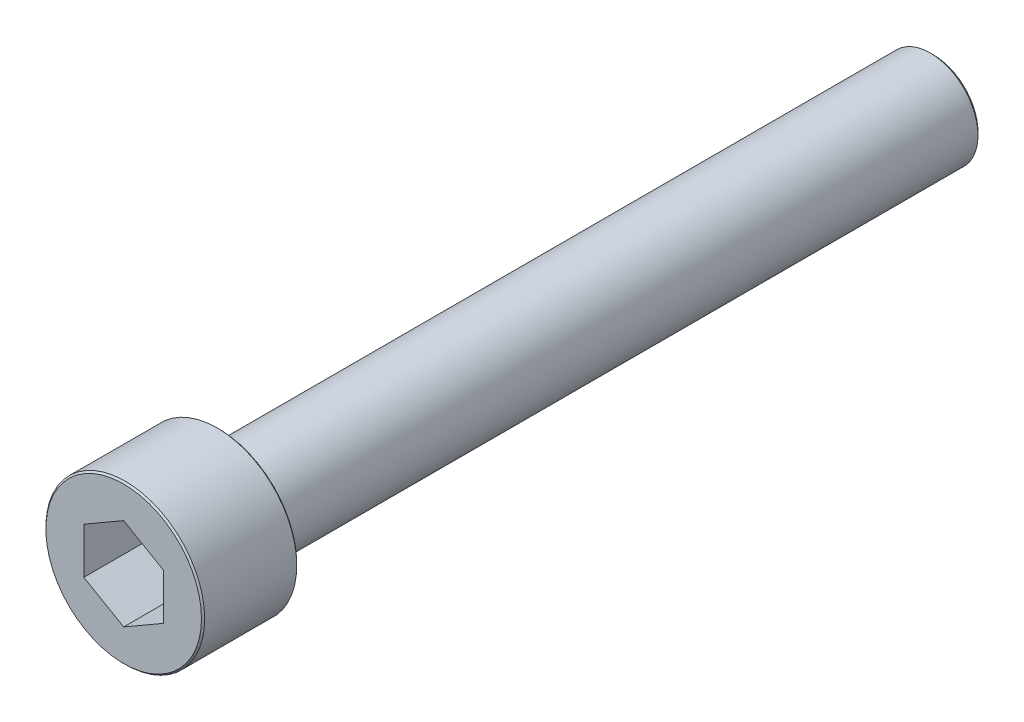
ISO-10303-21;
HEADER;
FILE_DESCRIPTION(('STEP AP214'),'2;1');
FILE_NAME('part.step','',(''),(''),'','','');
FILE_SCHEMA(('AUTOMOTIVE_DESIGN { 1 0 10303 214 1 1 1 1 }'));
ENDSEC;
DATA;
#1=APPLICATION_CONTEXT('core data for automotive mechanical design processes');
#2=APPLICATION_PROTOCOL_DEFINITION('international standard','automotive_design',2000,#1);
#3=PRODUCT_CONTEXT('',#1,'mechanical');
#4=PRODUCT('Part','Part','',(#3));
#5=PRODUCT_RELATED_PRODUCT_CATEGORY('part','',(#4));
#6=PRODUCT_DEFINITION_FORMATION('','',#4);
#7=PRODUCT_DEFINITION_CONTEXT('part definition',#1,'design');
#8=PRODUCT_DEFINITION('design','',#6,#7);
#9=PRODUCT_DEFINITION_SHAPE('','',#8);
#10=(LENGTH_UNIT() NAMED_UNIT(*) SI_UNIT(.MILLI.,.METRE.));
#11=(NAMED_UNIT(*) PLANE_ANGLE_UNIT() SI_UNIT($,.RADIAN.));
#12=(NAMED_UNIT(*) SI_UNIT($,.STERADIAN.) SOLID_ANGLE_UNIT());
#13=UNCERTAINTY_MEASURE_WITH_UNIT(LENGTH_MEASURE(1.E-05),#10,'distance_accuracy_value','');
#14=(GEOMETRIC_REPRESENTATION_CONTEXT(3) GLOBAL_UNCERTAINTY_ASSIGNED_CONTEXT((#13)) GLOBAL_UNIT_ASSIGNED_CONTEXT((#10,
#11,#12)) REPRESENTATION_CONTEXT('',''));
#15=CARTESIAN_POINT('',(0.,0.,0.));
#16=DIRECTION('',(0.,0.,1.));
#17=DIRECTION('',(1.,0.,0.));
#18=AXIS2_PLACEMENT_3D('',#15,#16,#17);
#19=CARTESIAN_POINT('',(0.,0.,45.));
#20=DIRECTION('',(0.,0.,1.));
#21=DIRECTION('',(1.,0.,0.));
#22=AXIS2_PLACEMENT_3D('',#19,#20,#21);
#23=CYLINDRICAL_SURFACE('',#22,5.);
#24=CARTESIAN_POINT('',(0.,0.,45.1000429565118));
#25=DIRECTION('',(0.,0.,-1.));
#26=DIRECTION('',(-1.,0.,0.));
#27=AXIS2_PLACEMENT_3D('',#24,#25,#26);
#28=CIRCLE('',#27,5.);
#29=CARTESIAN_POINT('',(-5.,0.,45.1000429565118));
#30=VERTEX_POINT('',#29);
#31=EDGE_CURVE('E153',#30,#30,#28,.F.);
#32=ORIENTED_EDGE('',*,*,#31,.T.);
#33=EDGE_LOOP('',(#32));
#34=FACE_BOUND('',#33,.T.);
#35=CARTESIAN_POINT('',(0.,0.,50.8999561664587));
#36=DIRECTION('',(0.,0.,1.));
#37=DIRECTION('',(1.,0.,0.));
#38=AXIS2_PLACEMENT_3D('',#35,#36,#37);
#39=CIRCLE('',#38,5.);
#40=CARTESIAN_POINT('',(5.,0.,50.8999561664587));
#41=VERTEX_POINT('',#40);
#42=EDGE_CURVE('E150',#41,#41,#39,.F.);
#43=ORIENTED_EDGE('',*,*,#42,.T.);
#44=EDGE_LOOP('',(#43));
#45=FACE_BOUND('',#44,.T.);
#46=ADVANCED_FACE('F39',(#34,#45),#23,.T.);
#47=CARTESIAN_POINT('',(5.,0.,45.));
#48=DIRECTION('',(0.,0.,-1.));
#49=DIRECTION('',(-1.,0.,0.));
#50=AXIS2_PLACEMENT_3D('',#47,#48,#49);
#51=PLANE('',#50);
#52=CARTESIAN_POINT('',(0.,0.,45.));
#53=DIRECTION('',(0.,0.,-1.));
#54=DIRECTION('',(-1.,0.,0.));
#55=AXIS2_PLACEMENT_3D('',#52,#53,#54);
#56=CIRCLE('',#55,4.89995616645868);
#57=CARTESIAN_POINT('',(-4.89995616645868,0.,45.));
#58=VERTEX_POINT('',#57);
#59=EDGE_CURVE('E156',#58,#58,#56,.T.);
#60=ORIENTED_EDGE('',*,*,#59,.T.);
#61=EDGE_LOOP('',(#60));
#62=FACE_BOUND('',#61,.T.);
#63=CARTESIAN_POINT('',(0.,0.,45.));
#64=DIRECTION('',(0.,0.,-1.));
#65=DIRECTION('',(-1.,0.,0.));
#66=AXIS2_PLACEMENT_3D('',#63,#64,#65);
#67=CIRCLE('',#66,3.);
#68=CARTESIAN_POINT('',(3.,0.,45.));
#69=VERTEX_POINT('',#68);
#70=EDGE_CURVE('E142',#69,#69,#67,.T.);
#71=ORIENTED_EDGE('',*,*,#70,.F.);
#72=EDGE_LOOP('',(#71));
#73=FACE_BOUND('',#72,.T.);
#74=ADVANCED_FACE('F176',(#62,#73),#51,.T.);
#75=CARTESIAN_POINT('',(0.,0.,51.));
#76=DIRECTION('',(0.,0.,1.));
#77=DIRECTION('',(1.,0.,0.));
#78=AXIS2_PLACEMENT_3D('',#75,#76,#77);
#79=PLANE('',#78);
#80=CARTESIAN_POINT('',(0.,0.,51.));
#81=DIRECTION('',(0.,0.,1.));
#82=DIRECTION('',(1.,0.,0.));
#83=AXIS2_PLACEMENT_3D('',#80,#81,#82);
#84=CIRCLE('',#83,4.89995704348817);
#85=CARTESIAN_POINT('',(4.89995704348817,0.,51.));
#86=VERTEX_POINT('',#85);
#87=EDGE_CURVE('E159',#86,#86,#84,.T.);
#88=ORIENTED_EDGE('',*,*,#87,.T.);
#89=EDGE_LOOP('',(#88));
#90=FACE_BOUND('',#89,.T.);
#91=DIRECTION('',(0.,-1.,0.));
#92=VECTOR('',#91,1.);
#93=CARTESIAN_POINT('',(-2.51,1.449149175666,51.));
#94=LINE('',#93,#92);
#95=CARTESIAN_POINT('',(-2.51,1.449149175666,51.));
#96=VERTEX_POINT('',#95);
#97=CARTESIAN_POINT('',(-2.51,-1.449149175666,51.));
#98=VERTEX_POINT('',#97);
#99=EDGE_CURVE('E55',#96,#98,#94,.T.);
#100=ORIENTED_EDGE('',*,*,#99,.F.);
#101=DIRECTION('',(-0.866025403784431,-0.500000000000014,0.));
#102=VECTOR('',#101,1.);
#103=CARTESIAN_POINT('',(0.,2.89829835133201,51.));
#104=LINE('',#103,#102);
#105=CARTESIAN_POINT('',(0.,2.89829835133201,51.));
#106=VERTEX_POINT('',#105);
#107=EDGE_CURVE('E138',#106,#96,#104,.T.);
#108=ORIENTED_EDGE('',*,*,#107,.F.);
#109=DIRECTION('',(-0.866025403784431,0.500000000000014,0.));
#110=VECTOR('',#109,1.);
#111=CARTESIAN_POINT('',(2.51,1.449149175666,51.));
#112=LINE('',#111,#110);
#113=CARTESIAN_POINT('',(2.51,1.449149175666,51.));
#114=VERTEX_POINT('',#113);
#115=EDGE_CURVE('E136',#114,#106,#112,.T.);
#116=ORIENTED_EDGE('',*,*,#115,.F.);
#117=DIRECTION('',(0.,1.,0.));
#118=VECTOR('',#117,1.);
#119=CARTESIAN_POINT('',(2.51,-1.449149175666,51.));
#120=LINE('',#119,#118);
#121=CARTESIAN_POINT('',(2.51,-1.449149175666,51.));
#122=VERTEX_POINT('',#121);
#123=EDGE_CURVE('E103',#122,#114,#120,.T.);
#124=ORIENTED_EDGE('',*,*,#123,.F.);
#125=DIRECTION('',(0.866025403784431,0.500000000000013,0.));
#126=VECTOR('',#125,1.);
#127=CARTESIAN_POINT('',(0.,-2.898298351332,51.));
#128=LINE('',#127,#126);
#129=CARTESIAN_POINT('',(0.,-2.898298351332,51.));
#130=VERTEX_POINT('',#129);
#131=EDGE_CURVE('E132',#130,#122,#128,.T.);
#132=ORIENTED_EDGE('',*,*,#131,.F.);
#133=DIRECTION('',(0.866025403784432,-0.500000000000012,0.));
#134=VECTOR('',#133,1.);
#135=CARTESIAN_POINT('',(-2.51,-1.449149175666,51.));
#136=LINE('',#135,#134);
#137=EDGE_CURVE('E129',#98,#130,#136,.T.);
#138=ORIENTED_EDGE('',*,*,#137,.F.);
#139=EDGE_LOOP('',(#100,#108,#116,#124,#132,#138));
#140=FACE_BOUND('',#139,.T.);
#141=ADVANCED_FACE('F182',(#90,#140),#79,.T.);
#142=CARTESIAN_POINT('',(0.,0.,0.));
#143=DIRECTION('',(0.,0.,1.));
#144=DIRECTION('',(1.,0.,0.));
#145=AXIS2_PLACEMENT_3D('',#142,#143,#144);
#146=CYLINDRICAL_SURFACE('',#145,3.);
#147=CARTESIAN_POINT('',(0.,0.,0.200074658536884));
#148=DIRECTION('',(0.,0.,-1.));
#149=DIRECTION('',(-1.,0.,0.));
#150=AXIS2_PLACEMENT_3D('',#147,#148,#149);
#151=CIRCLE('',#150,3.);
#152=CARTESIAN_POINT('',(3.,0.,0.200074658536884));
#153=VERTEX_POINT('',#152);
#154=EDGE_CURVE('E11',#153,#153,#151,.F.);
#155=CARTESIAN_POINT('',(3.,0.,0.200074658536884));
#156=CARTESIAN_POINT('',(3.,0.,0.666740547510459));
#157=CARTESIAN_POINT('',(3.,0.,1.13340643648403));
#158=CARTESIAN_POINT('',(3.,0.,2.06673821443118));
#159=CARTESIAN_POINT('',(3.,0.,2.53340410340476));
#160=CARTESIAN_POINT('',(3.,0.,3.4667358813519));
#161=CARTESIAN_POINT('',(3.,0.,3.93340177032548));
#162=CARTESIAN_POINT('',(3.,0.,4.86673354827263));
#163=CARTESIAN_POINT('',(3.,0.,5.3333994372462));
#164=CARTESIAN_POINT('',(3.,0.,6.26673121519335));
#165=CARTESIAN_POINT('',(3.,0.,6.73339710416692));
#166=CARTESIAN_POINT('',(3.,0.,7.66672888211407));
#167=CARTESIAN_POINT('',(3.,0.,8.13339477108765));
#168=CARTESIAN_POINT('',(3.,0.,9.06672654903479));
#169=CARTESIAN_POINT('',(3.,0.,9.53339243800837));
#170=CARTESIAN_POINT('',(3.,0.,10.4667242159555));
#171=CARTESIAN_POINT('',(3.,0.,10.9333901049291));
#172=CARTESIAN_POINT('',(3.,0.,11.8667218828762));
#173=CARTESIAN_POINT('',(3.,0.,12.3333877718498));
#174=CARTESIAN_POINT('',(3.,0.,13.266719549797));
#175=CARTESIAN_POINT('',(3.,0.,13.7333854387705));
#176=CARTESIAN_POINT('',(3.,0.,14.6667172167177));
#177=CARTESIAN_POINT('',(3.,0.,15.1333831056913));
#178=CARTESIAN_POINT('',(3.,0.,16.0667148836384));
#179=CARTESIAN_POINT('',(3.,0.,16.533380772612));
#180=CARTESIAN_POINT('',(3.,0.,17.4667125505591));
#181=CARTESIAN_POINT('',(3.,0.,17.9333784395327));
#182=CARTESIAN_POINT('',(3.,0.,18.8667102174799));
#183=CARTESIAN_POINT('',(3.,0.,19.3333761064534));
#184=CARTESIAN_POINT('',(3.,0.,20.2667078844006));
#185=CARTESIAN_POINT('',(3.,0.,20.7333737733741));
#186=CARTESIAN_POINT('',(3.,0.,21.6667055513213));
#187=CARTESIAN_POINT('',(3.,0.,22.1333714402949));
#188=CARTESIAN_POINT('',(3.,0.,23.066703218242));
#189=CARTESIAN_POINT('',(3.,0.,23.5333691072156));
#190=CARTESIAN_POINT('',(3.,0.,24.4667008851627));
#191=CARTESIAN_POINT('',(3.,0.,24.9333667741363));
#192=CARTESIAN_POINT('',(3.,0.,25.8666985520835));
#193=CARTESIAN_POINT('',(3.,0.,26.333364441057));
#194=CARTESIAN_POINT('',(3.,0.,27.2666962190042));
#195=CARTESIAN_POINT('',(3.,0.,27.7333621079778));
#196=CARTESIAN_POINT('',(3.,0.,28.6666938859249));
#197=CARTESIAN_POINT('',(3.,0.,29.1333597748985));
#198=CARTESIAN_POINT('',(3.,0.,30.0666915528456));
#199=CARTESIAN_POINT('',(3.,0.,30.5333574418192));
#200=CARTESIAN_POINT('',(3.,0.,31.4666892197664));
#201=CARTESIAN_POINT('',(3.,0.,31.9333551087399));
#202=CARTESIAN_POINT('',(3.,0.,32.8666868866871));
#203=CARTESIAN_POINT('',(3.,0.,33.3333527756607));
#204=CARTESIAN_POINT('',(3.,0.,34.2666845536078));
#205=CARTESIAN_POINT('',(3.,0.,34.7333504425814));
#206=CARTESIAN_POINT('',(3.,0.,35.6666822205285));
#207=CARTESIAN_POINT('',(3.,0.,36.1333481095021));
#208=CARTESIAN_POINT('',(3.,0.,37.0666798874492));
#209=CARTESIAN_POINT('',(3.,0.,37.5333457764228));
#210=CARTESIAN_POINT('',(3.,0.,38.46667755437));
#211=CARTESIAN_POINT('',(3.,0.,38.9333434433435));
#212=CARTESIAN_POINT('',(3.,0.,39.8666752212907));
#213=CARTESIAN_POINT('',(3.,0.,40.3333411102643));
#214=CARTESIAN_POINT('',(3.,0.,41.2666728882114));
#215=CARTESIAN_POINT('',(3.,0.,41.733338777185));
#216=CARTESIAN_POINT('',(3.,0.,42.6666705551321));
#217=CARTESIAN_POINT('',(3.,0.,43.1333364441057));
#218=CARTESIAN_POINT('',(3.,0.,44.0666682220529));
#219=CARTESIAN_POINT('',(3.,0.,44.5333341110264));
#220=CARTESIAN_POINT('',(3.,0.,45.));
#221=B_SPLINE_CURVE_WITH_KNOTS('',3,(#155,#156,#157,#158,#159,#160,#161,#162,#163,#164,#165,
#166,#167,#168,#169,#170,#171,#172,#173,#174,#175,#176,#177,#178,#179,#180,#181,#182,#183,#184,
#185,#186,#187,#188,#189,#190,#191,#192,#193,#194,#195,#196,#197,#198,#199,#200,#201,#202,#203,
#204,#205,#206,#207,#208,#209,#210,#211,#212,#213,#214,#215,#216,#217,#218,#219,#220),
.UNSPECIFIED.,.F.,.F.,(4,2,2,2,2,2,2,2,2,2,2,2,2,2,2,2,2,2,2,2,2,2,2,2,2,2,2,2,2,2,2,2,4),(0.,
1.39999766692072,2.79999533384144,4.19999300076217,5.59999066768289,6.99998833460361,
8.39998600152433,9.79998366844506,11.1999813353658,12.5999790022865,13.9999766692072,
15.3999743361279,16.7999720030487,18.1999696699694,19.5999673368901,20.9999650038108,
22.3999626707316,23.7999603376523,25.199958004573,26.5999556714937,27.9999533384144,
29.3999510053352,30.7999486722559,32.1999463391766,33.5999440060973,34.9999416730181,
36.3999393399388,37.7999370068595,39.1999346737802,40.599932340701,41.9999300076217,
43.3999276745424,44.7999253414631),.UNSPECIFIED.);
#222=EDGE_CURVE('BSEAM209',#153,#69,#221,.T.);
#223=ORIENTED_EDGE('',*,*,#154,.T.);
#224=ORIENTED_EDGE('',*,*,#70,.T.);
#225=ORIENTED_EDGE('',*,*,#222,.T.);
#226=ORIENTED_EDGE('',*,*,#222,.F.);
#227=EDGE_LOOP('',(#223,#225,#224,#226));
#228=FACE_BOUND('',#227,.T.);
#229=ADVANCED_FACE('F209',(#228),#146,.T.);
#230=CARTESIAN_POINT('',(0.,0.,0.));
#231=DIRECTION('',(0.,0.,-1.));
#232=DIRECTION('',(-1.,0.,0.));
#233=AXIS2_PLACEMENT_3D('',#230,#231,#232);
#234=PLANE('',#233);
#235=CARTESIAN_POINT('',(0.,0.,0.));
#236=DIRECTION('',(0.,0.,-1.));
#237=DIRECTION('',(-1.,0.,0.));
#238=AXIS2_PLACEMENT_3D('',#235,#236,#237);
#239=CIRCLE('',#238,2.79993032049591);
#240=CARTESIAN_POINT('',(-2.79993032049591,0.,0.));
#241=VERTEX_POINT('',#240);
#242=EDGE_CURVE('E48',#241,#241,#239,.T.);
#243=ORIENTED_EDGE('',*,*,#242,.T.);
#244=EDGE_LOOP('',(#243));
#245=FACE_BOUND('',#244,.T.);
#246=ADVANCED_FACE('F164',(#245),#234,.T.);
#247=CARTESIAN_POINT('',(-2.51,1.449149175666,46.5));
#248=DIRECTION('',(-1.,0.,0.));
#249=DIRECTION('',(0.,-1.,0.));
#250=AXIS2_PLACEMENT_3D('',#247,#248,#249);
#251=PLANE('',#250);
#252=ORIENTED_EDGE('',*,*,#99,.T.);
#253=DIRECTION('',(0.,0.,1.));
#254=VECTOR('',#253,1.);
#255=CARTESIAN_POINT('',(-2.51,-1.449149175666,46.5));
#256=LINE('',#255,#254);
#257=CARTESIAN_POINT('',(-2.51,-1.449149175666,46.5));
#258=VERTEX_POINT('',#257);
#259=EDGE_CURVE('E85',#258,#98,#256,.T.);
#260=ORIENTED_EDGE('',*,*,#259,.F.);
#261=DIRECTION('',(0.,-1.,0.));
#262=VECTOR('',#261,1.);
#263=CARTESIAN_POINT('',(-2.51,1.449149175666,46.5));
#264=LINE('',#263,#262);
#265=CARTESIAN_POINT('',(-2.51,1.449149175666,46.5));
#266=VERTEX_POINT('',#265);
#267=EDGE_CURVE('E140',#266,#258,#264,.T.);
#268=ORIENTED_EDGE('',*,*,#267,.F.);
#269=DIRECTION('',(0.,0.,1.));
#270=VECTOR('',#269,1.);
#271=CARTESIAN_POINT('',(-2.51,1.449149175666,46.5));
#272=LINE('',#271,#270);
#273=EDGE_CURVE('E63',#266,#96,#272,.T.);
#274=ORIENTED_EDGE('',*,*,#273,.T.);
#275=EDGE_LOOP('',(#252,#260,#268,#274));
#276=FACE_BOUND('',#275,.T.);
#277=ADVANCED_FACE('F217',(#276),#251,.F.);
#278=CARTESIAN_POINT('',(0.,2.89829835133201,46.5));
#279=DIRECTION('',(-0.500000000000014,0.866025403784431,0.));
#280=DIRECTION('',(-0.866025403784431,-0.500000000000014,0.));
#281=AXIS2_PLACEMENT_3D('',#278,#279,#280);
#282=PLANE('',#281);
#283=ORIENTED_EDGE('',*,*,#107,.T.);
#284=ORIENTED_EDGE('',*,*,#273,.F.);
#285=DIRECTION('',(-0.866025403784431,-0.500000000000014,0.));
#286=VECTOR('',#285,1.);
#287=CARTESIAN_POINT('',(0.,2.89829835133201,46.5));
#288=LINE('',#287,#286);
#289=CARTESIAN_POINT('',(0.,2.89829835133201,46.5));
#290=VERTEX_POINT('',#289);
#291=EDGE_CURVE('E115',#290,#266,#288,.T.);
#292=ORIENTED_EDGE('',*,*,#291,.F.);
#293=DIRECTION('',(0.,0.,1.));
#294=VECTOR('',#293,1.);
#295=CARTESIAN_POINT('',(0.,2.89829835133201,46.5));
#296=LINE('',#295,#294);
#297=EDGE_CURVE('E107',#290,#106,#296,.T.);
#298=ORIENTED_EDGE('',*,*,#297,.T.);
#299=EDGE_LOOP('',(#283,#284,#292,#298));
#300=FACE_BOUND('',#299,.T.);
#301=ADVANCED_FACE('F223',(#300),#282,.F.);
#302=CARTESIAN_POINT('',(2.51,1.449149175666,46.5));
#303=DIRECTION('',(0.500000000000014,0.866025403784431,0.));
#304=DIRECTION('',(-0.866025403784431,0.500000000000014,0.));
#305=AXIS2_PLACEMENT_3D('',#302,#303,#304);
#306=PLANE('',#305);
#307=ORIENTED_EDGE('',*,*,#115,.T.);
#308=ORIENTED_EDGE('',*,*,#297,.F.);
#309=DIRECTION('',(-0.866025403784431,0.500000000000014,0.));
#310=VECTOR('',#309,1.);
#311=CARTESIAN_POINT('',(2.51,1.449149175666,46.5));
#312=LINE('',#311,#310);
#313=CARTESIAN_POINT('',(2.51,1.449149175666,46.5));
#314=VERTEX_POINT('',#313);
#315=EDGE_CURVE('E111',#314,#290,#312,.T.);
#316=ORIENTED_EDGE('',*,*,#315,.F.);
#317=DIRECTION('',(0.,0.,1.));
#318=VECTOR('',#317,1.);
#319=CARTESIAN_POINT('',(2.51,1.449149175666,46.5));
#320=LINE('',#319,#318);
#321=EDGE_CURVE('E96',#314,#114,#320,.T.);
#322=ORIENTED_EDGE('',*,*,#321,.T.);
#323=EDGE_LOOP('',(#307,#308,#316,#322));
#324=FACE_BOUND('',#323,.T.);
#325=ADVANCED_FACE('F112',(#324),#306,.F.);
#326=CARTESIAN_POINT('',(2.51,-1.449149175666,46.5));
#327=DIRECTION('',(1.,0.,0.));
#328=DIRECTION('',(0.,1.,0.));
#329=AXIS2_PLACEMENT_3D('',#326,#327,#328);
#330=PLANE('',#329);
#331=ORIENTED_EDGE('',*,*,#123,.T.);
#332=ORIENTED_EDGE('',*,*,#321,.F.);
#333=DIRECTION('',(0.,1.,0.));
#334=VECTOR('',#333,1.);
#335=CARTESIAN_POINT('',(2.51,-1.449149175666,46.5));
#336=LINE('',#335,#334);
#337=CARTESIAN_POINT('',(2.51,-1.449149175666,46.5));
#338=VERTEX_POINT('',#337);
#339=EDGE_CURVE('E100',#338,#314,#336,.T.);
#340=ORIENTED_EDGE('',*,*,#339,.F.);
#341=DIRECTION('',(0.,0.,1.));
#342=VECTOR('',#341,1.);
#343=CARTESIAN_POINT('',(2.51,-1.449149175666,46.5));
#344=LINE('',#343,#342);
#345=EDGE_CURVE('E108',#338,#122,#344,.T.);
#346=ORIENTED_EDGE('',*,*,#345,.T.);
#347=EDGE_LOOP('',(#331,#332,#340,#346));
#348=FACE_BOUND('',#347,.T.);
#349=ADVANCED_FACE('F98',(#348),#330,.F.);
#350=CARTESIAN_POINT('',(0.,-2.898298351332,46.5));
#351=DIRECTION('',(0.500000000000013,-0.866025403784431,0.));
#352=DIRECTION('',(0.866025403784431,0.500000000000013,0.));
#353=AXIS2_PLACEMENT_3D('',#350,#351,#352);
#354=PLANE('',#353);
#355=ORIENTED_EDGE('',*,*,#131,.T.);
#356=ORIENTED_EDGE('',*,*,#345,.F.);
#357=DIRECTION('',(0.866025403784431,0.500000000000013,0.));
#358=VECTOR('',#357,1.);
#359=CARTESIAN_POINT('',(0.,-2.898298351332,46.5));
#360=LINE('',#359,#358);
#361=CARTESIAN_POINT('',(0.,-2.898298351332,46.5));
#362=VERTEX_POINT('',#361);
#363=EDGE_CURVE('E121',#362,#338,#360,.T.);
#364=ORIENTED_EDGE('',*,*,#363,.F.);
#365=DIRECTION('',(0.,0.,1.));
#366=VECTOR('',#365,1.);
#367=CARTESIAN_POINT('',(0.,-2.898298351332,46.5));
#368=LINE('',#367,#366);
#369=EDGE_CURVE('E145',#362,#130,#368,.T.);
#370=ORIENTED_EDGE('',*,*,#369,.T.);
#371=EDGE_LOOP('',(#355,#356,#364,#370));
#372=FACE_BOUND('',#371,.T.);
#373=ADVANCED_FACE('F226',(#372),#354,.F.);
#374=CARTESIAN_POINT('',(-2.51,-1.449149175666,46.5));
#375=DIRECTION('',(-0.500000000000012,-0.866025403784432,0.));
#376=DIRECTION('',(0.866025403784432,-0.500000000000012,0.));
#377=AXIS2_PLACEMENT_3D('',#374,#375,#376);
#378=PLANE('',#377);
#379=ORIENTED_EDGE('',*,*,#137,.T.);
#380=ORIENTED_EDGE('',*,*,#369,.F.);
#381=DIRECTION('',(0.866025403784432,-0.500000000000012,0.));
#382=VECTOR('',#381,1.);
#383=CARTESIAN_POINT('',(-2.51,-1.449149175666,46.5));
#384=LINE('',#383,#382);
#385=EDGE_CURVE('E123',#258,#362,#384,.T.);
#386=ORIENTED_EDGE('',*,*,#385,.F.);
#387=ORIENTED_EDGE('',*,*,#259,.T.);
#388=EDGE_LOOP('',(#379,#380,#386,#387));
#389=FACE_BOUND('',#388,.T.);
#390=ADVANCED_FACE('F201',(#389),#378,.F.);
#391=CARTESIAN_POINT('',(0.,0.,46.5));
#392=DIRECTION('',(0.,0.,1.));
#393=DIRECTION('',(1.,0.,0.));
#394=AXIS2_PLACEMENT_3D('',#391,#392,#393);
#395=PLANE('',#394);
#396=ORIENTED_EDGE('',*,*,#267,.T.);
#397=ORIENTED_EDGE('',*,*,#385,.T.);
#398=ORIENTED_EDGE('',*,*,#363,.T.);
#399=ORIENTED_EDGE('',*,*,#339,.T.);
#400=ORIENTED_EDGE('',*,*,#315,.T.);
#401=ORIENTED_EDGE('',*,*,#291,.T.);
#402=EDGE_LOOP('',(#396,#397,#398,#399,#400,#401));
#403=FACE_BOUND('',#402,.T.);
#404=ADVANCED_FACE('F118',(#403),#395,.T.);
#405=CARTESIAN_POINT('',(0.,0.,45.1000429565118));
#406=DIRECTION('',(0.,0.,1.));
#407=DIRECTION('',(1.,0.,0.));
#408=AXIS2_PLACEMENT_3D('',#405,#406,#407);
#409=CONICAL_SURFACE('',#408,5.,0.78540254664277);
#410=ORIENTED_EDGE('',*,*,#59,.F.);
#411=EDGE_LOOP('',(#410));
#412=FACE_BOUND('',#411,.T.);
#413=ORIENTED_EDGE('',*,*,#31,.F.);
#414=EDGE_LOOP('',(#413));
#415=FACE_BOUND('',#414,.T.);
#416=ADVANCED_FACE('F172',(#412,#415),#409,.T.);
#417=CARTESIAN_POINT('',(0.,0.,51.));
#418=DIRECTION('',(0.,0.,-1.));
#419=DIRECTION('',(-1.,0.,0.));
#420=AXIS2_PLACEMENT_3D('',#417,#418,#419);
#421=CONICAL_SURFACE('',#420,4.89995704348817,0.785393780152153);
#422=ORIENTED_EDGE('',*,*,#42,.F.);
#423=EDGE_LOOP('',(#422));
#424=FACE_BOUND('',#423,.T.);
#425=ORIENTED_EDGE('',*,*,#87,.F.);
#426=EDGE_LOOP('',(#425));
#427=FACE_BOUND('',#426,.T.);
#428=ADVANCED_FACE('F167',(#424,#427),#421,.T.);
#429=CARTESIAN_POINT('',(0.,0.,0.));
#430=DIRECTION('',(0.,0.,1.));
#431=DIRECTION('',(1.,0.,0.));
#432=AXIS2_PLACEMENT_3D('',#429,#430,#431);
#433=CONICAL_SURFACE('',#432,2.79993032049591,0.785385720305484);
#434=ORIENTED_EDGE('',*,*,#154,.F.);
#435=EDGE_LOOP('',(#434));
#436=FACE_BOUND('',#435,.T.);
#437=ORIENTED_EDGE('',*,*,#242,.F.);
#438=EDGE_LOOP('',(#437));
#439=FACE_BOUND('',#438,.T.);
#440=ADVANCED_FACE('F42',(#436,#439),#433,.T.);
#441=CLOSED_SHELL('',(#46,#74,#141,#229,#246,#277,#301,#325,#349,#373,#390,#404,#416,#428,#440));
#442=MANIFOLD_SOLID_BREP('B2',#441);
#443=ADVANCED_BREP_SHAPE_REPRESENTATION('',(#18,#442),#14);
#444=SHAPE_DEFINITION_REPRESENTATION(#9,#443);
ENDSEC;
END-ISO-10303-21;
